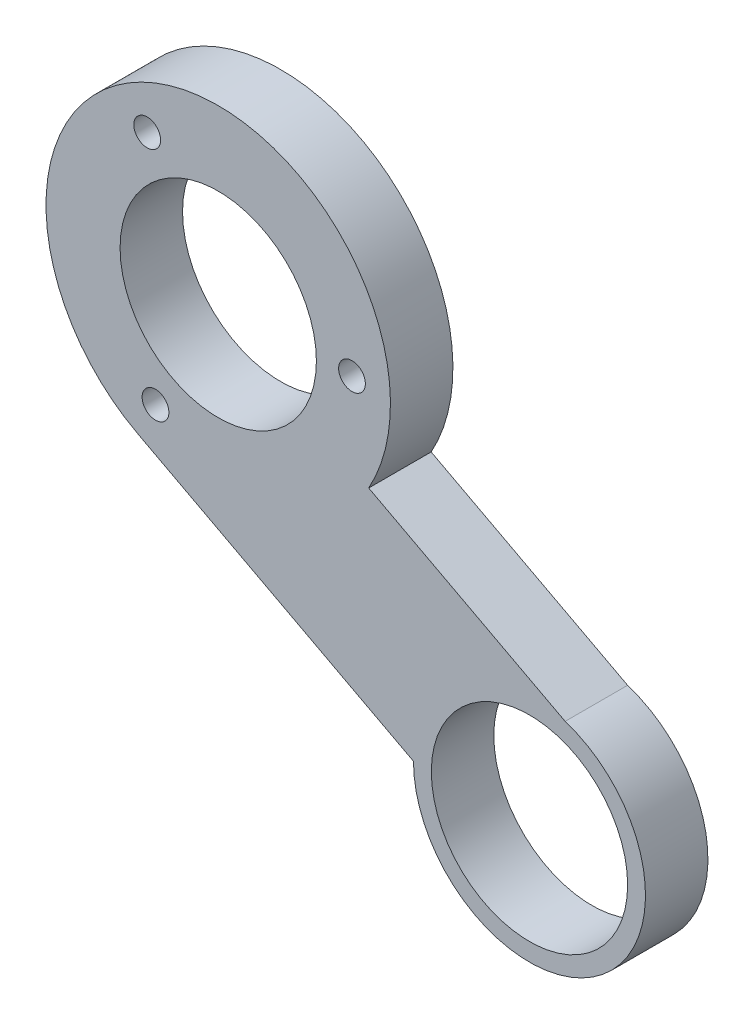
ISO-10303-21;
HEADER;
FILE_DESCRIPTION(('STEP AP214'),'2;1');
FILE_NAME('part.step','',(''),(''),'','','');
FILE_SCHEMA(('AUTOMOTIVE_DESIGN { 1 0 10303 214 1 1 1 1 }'));
ENDSEC;
DATA;
#1=APPLICATION_CONTEXT('core data for automotive mechanical design processes');
#2=APPLICATION_PROTOCOL_DEFINITION('international standard','automotive_design',2000,#1);
#3=PRODUCT_CONTEXT('',#1,'mechanical');
#4=PRODUCT('Part','Part','',(#3));
#5=PRODUCT_RELATED_PRODUCT_CATEGORY('part','',(#4));
#6=PRODUCT_DEFINITION_FORMATION('','',#4);
#7=PRODUCT_DEFINITION_CONTEXT('part definition',#1,'design');
#8=PRODUCT_DEFINITION('design','',#6,#7);
#9=PRODUCT_DEFINITION_SHAPE('','',#8);
#10=(LENGTH_UNIT() NAMED_UNIT(*) SI_UNIT(.MILLI.,.METRE.));
#11=(NAMED_UNIT(*) PLANE_ANGLE_UNIT() SI_UNIT($,.RADIAN.));
#12=(NAMED_UNIT(*) SI_UNIT($,.STERADIAN.) SOLID_ANGLE_UNIT());
#13=UNCERTAINTY_MEASURE_WITH_UNIT(LENGTH_MEASURE(1.E-05),#10,'distance_accuracy_value','');
#14=(GEOMETRIC_REPRESENTATION_CONTEXT(3) GLOBAL_UNCERTAINTY_ASSIGNED_CONTEXT((#13)) GLOBAL_UNIT_ASSIGNED_CONTEXT((#10,
#11,#12)) REPRESENTATION_CONTEXT('',''));
#15=CARTESIAN_POINT('',(0.,0.,0.));
#16=DIRECTION('',(0.,0.,1.));
#17=DIRECTION('',(1.,0.,0.));
#18=AXIS2_PLACEMENT_3D('',#15,#16,#17);
#19=CARTESIAN_POINT('',(-14.1274224536886,5.37928778044168,100.965717056062));
#20=DIRECTION('',(0.,0.,-1.));
#21=DIRECTION('',(-1.,0.,0.));
#22=AXIS2_PLACEMENT_3D('',#19,#20,#21);
#23=CYLINDRICAL_SURFACE('',#22,11.);
#24=CARTESIAN_POINT('',(-14.1274224536886,5.37928778044168,0.));
#25=DIRECTION('',(0.,0.,1.));
#26=DIRECTION('',(1.,0.,0.));
#27=AXIS2_PLACEMENT_3D('',#24,#25,#26);
#28=CIRCLE('',#27,11.);
#29=CARTESIAN_POINT('',(-25.1274224536886,5.37928778044168,0.));
#30=VERTEX_POINT('',#29);
#31=EDGE_CURVE('E129',#30,#30,#28,.T.);
#32=CARTESIAN_POINT('',(-14.1274224536886,5.37928778044168,7.00000000000442));
#33=DIRECTION('',(0.,0.,1.));
#34=DIRECTION('',(0.,-1.,0.));
#35=AXIS2_PLACEMENT_3D('',#32,#33,#34);
#36=CIRCLE('',#35,11.);
#37=CARTESIAN_POINT('',(-25.1274224536886,5.37928778044168,7.00000000000443));
#38=VERTEX_POINT('',#37);
#39=EDGE_CURVE('E108',#38,#38,#36,.T.);
#40=CARTESIAN_POINT('',(-25.1274224536886,5.37928778044168,0.));
#41=CARTESIAN_POINT('',(-25.1274224536886,5.37928778044168,0.0729166666667003));
#42=CARTESIAN_POINT('',(-25.1274224536886,5.37928778044168,0.145833333333414));
#43=CARTESIAN_POINT('',(-25.1274224536886,5.37928778044168,0.291666666666843));
#44=CARTESIAN_POINT('',(-25.1274224536886,5.37928778044168,0.364583333333557));
#45=CARTESIAN_POINT('',(-25.1274224536886,5.37928778044168,0.51041666666698));
#46=CARTESIAN_POINT('',(-25.1274224536886,5.37928778044168,0.58333333333369));
#47=CARTESIAN_POINT('',(-25.1274224536886,5.37928778044168,0.729166666667114));
#48=CARTESIAN_POINT('',(-25.1274224536886,5.37928778044168,0.802083333333828));
#49=CARTESIAN_POINT('',(-25.1274224536886,5.37928778044168,0.947916666667256));
#50=CARTESIAN_POINT('',(-25.1274224536886,5.37928778044168,1.02083333333397));
#51=CARTESIAN_POINT('',(-25.1274224536886,5.37928778044168,1.16666666666739));
#52=CARTESIAN_POINT('',(-25.1274224536886,5.37928778044168,1.2395833333341));
#53=CARTESIAN_POINT('',(-25.1274224536886,5.37928778044168,1.38541666666753));
#54=CARTESIAN_POINT('',(-25.1274224536886,5.37928778044168,1.45833333333424));
#55=CARTESIAN_POINT('',(-25.1274224536886,5.37928778044168,1.60416666666767));
#56=CARTESIAN_POINT('',(-25.1274224536886,5.37928778044168,1.67708333333438));
#57=CARTESIAN_POINT('',(-25.1274224536886,5.37928778044168,1.82291666666781));
#58=CARTESIAN_POINT('',(-25.1274224536886,5.37928778044168,1.89583333333453));
#59=CARTESIAN_POINT('',(-25.1274224536886,5.37928778044168,2.04166666666795));
#60=CARTESIAN_POINT('',(-25.1274224536886,5.37928778044168,2.11458333333467));
#61=CARTESIAN_POINT('',(-25.1274224536886,5.37928778044168,2.26041666666809));
#62=CARTESIAN_POINT('',(-25.1274224536886,5.37928778044168,2.3333333333348));
#63=CARTESIAN_POINT('',(-25.1274224536886,5.37928778044168,2.47916666666823));
#64=CARTESIAN_POINT('',(-25.1274224536886,5.37928778044168,2.55208333333494));
#65=CARTESIAN_POINT('',(-25.1274224536886,5.37928778044168,2.69791666666837));
#66=CARTESIAN_POINT('',(-25.1274224536886,5.37928778044168,2.77083333333508));
#67=CARTESIAN_POINT('',(-25.1274224536886,5.37928778044168,2.91666666666851));
#68=CARTESIAN_POINT('',(-25.1274224536886,5.37928778044168,2.98958333333522));
#69=CARTESIAN_POINT('',(-25.1274224536886,5.37928778044168,3.13541666666864));
#70=CARTESIAN_POINT('',(-25.1274224536886,5.37928778044168,3.20833333333535));
#71=CARTESIAN_POINT('',(-25.1274224536886,5.37928778044168,3.35416666666878));
#72=CARTESIAN_POINT('',(-25.1274224536886,5.37928778044168,3.4270833333355));
#73=CARTESIAN_POINT('',(-25.1274224536886,5.37928778044168,3.57291666666892));
#74=CARTESIAN_POINT('',(-25.1274224536886,5.37928778044168,3.64583333333564));
#75=CARTESIAN_POINT('',(-25.1274224536886,5.37928778044168,3.79166666666907));
#76=CARTESIAN_POINT('',(-25.1274224536886,5.37928778044168,3.86458333333578));
#77=CARTESIAN_POINT('',(-25.1274224536886,5.37928778044168,4.0104166666692));
#78=CARTESIAN_POINT('',(-25.1274224536886,5.37928778044168,4.08333333333591));
#79=CARTESIAN_POINT('',(-25.1274224536886,5.37928778044168,4.22916666666934));
#80=CARTESIAN_POINT('',(-25.1274224536886,5.37928778044168,4.30208333333605));
#81=CARTESIAN_POINT('',(-25.1274224536886,5.37928778044168,4.44791666666948));
#82=CARTESIAN_POINT('',(-25.1274224536886,5.37928778044168,4.52083333333619));
#83=CARTESIAN_POINT('',(-25.1274224536886,5.37928778044168,4.66666666666962));
#84=CARTESIAN_POINT('',(-25.1274224536886,5.37928778044168,4.73958333333633));
#85=CARTESIAN_POINT('',(-25.1274224536886,5.37928778044168,4.88541666666975));
#86=CARTESIAN_POINT('',(-25.1274224536886,5.37928778044168,4.95833333333646));
#87=CARTESIAN_POINT('',(-25.1274224536886,5.37928778044168,5.10416666666989));
#88=CARTESIAN_POINT('',(-25.1274224536886,5.37928778044168,5.17708333333661));
#89=CARTESIAN_POINT('',(-25.1274224536886,5.37928778044168,5.32291666667004));
#90=CARTESIAN_POINT('',(-25.1274224536886,5.37928778044168,5.39583333333675));
#91=CARTESIAN_POINT('',(-25.1274224536886,5.37928778044168,5.54166666667018));
#92=CARTESIAN_POINT('',(-25.1274224536886,5.37928778044168,5.61458333333689));
#93=CARTESIAN_POINT('',(-25.1274224536886,5.37928778044168,5.76041666667032));
#94=CARTESIAN_POINT('',(-25.1274224536886,5.37928778044168,5.83333333333703));
#95=CARTESIAN_POINT('',(-25.1274224536886,5.37928778044168,5.97916666667045));
#96=CARTESIAN_POINT('',(-25.1274224536886,5.37928778044168,6.05208333333716));
#97=CARTESIAN_POINT('',(-25.1274224536886,5.37928778044168,6.19791666667059));
#98=CARTESIAN_POINT('',(-25.1274224536886,5.37928778044168,6.27083333333731));
#99=CARTESIAN_POINT('',(-25.1274224536886,5.37928778044168,6.41666666667073));
#100=CARTESIAN_POINT('',(-25.1274224536886,5.37928778044168,6.48958333333744));
#101=CARTESIAN_POINT('',(-25.1274224536886,5.37928778044168,6.63541666667086));
#102=CARTESIAN_POINT('',(-25.1274224536886,5.37928778044168,6.70833333333758));
#103=CARTESIAN_POINT('',(-25.1274224536886,5.37928778044168,6.854166666671));
#104=CARTESIAN_POINT('',(-25.1274224536886,5.37928778044168,6.92708333333772));
#105=CARTESIAN_POINT('',(-25.1274224536886,5.37928778044168,7.00000000000443));
#106=B_SPLINE_CURVE_WITH_KNOTS('',3,(#40,#41,#42,#43,#44,#45,#46,#47,#48,#49,#50,#51,#52,#53,
#54,#55,#56,#57,#58,#59,#60,#61,#62,#63,#64,#65,#66,#67,#68,#69,#70,#71,#72,#73,#74,#75,#76,#77,
#78,#79,#80,#81,#82,#83,#84,#85,#86,#87,#88,#89,#90,#91,#92,#93,#94,#95,#96,#97,#98,#99,#100,
#101,#102,#103,#104,#105),.UNSPECIFIED.,.F.,.F.,(4,2,2,2,2,2,2,2,2,2,2,2,2,2,2,2,2,2,2,2,2,2,2,
2,2,2,2,2,2,2,2,2,4),(0.,0.218750000000142,0.437500000000285,0.656250000000413,
0.875000000000556,1.0937500000007,1.31250000000083,1.53125000000097,1.75000000000111,
1.96875000000125,2.1875000000014,2.40625000000153,2.62500000000167,2.84375000000181,
3.06250000000194,3.28125000000208,3.50000000000222,3.71875000000237,3.93750000000251,
4.15625000000264,4.37500000000278,4.59375000000292,4.81250000000305,5.03125000000319,
5.25000000000334,5.46875000000348,5.68750000000362,5.90625000000375,6.12500000000389,
6.34375000000403,6.56250000000416,6.78125000000431,7.00000000000445),.UNSPECIFIED.);
#107=EDGE_CURVE('BSEAM34',#30,#38,#106,.T.);
#108=ORIENTED_EDGE('',*,*,#31,.F.);
#109=ORIENTED_EDGE('',*,*,#39,.T.);
#110=ORIENTED_EDGE('',*,*,#107,.T.);
#111=ORIENTED_EDGE('',*,*,#107,.F.);
#112=EDGE_LOOP('',(#108,#110,#109,#111));
#113=FACE_BOUND('',#112,.T.);
#114=ADVANCED_FACE('F34',(#113),#23,.F.);
#115=CARTESIAN_POINT('',(-22.0878416801819,18.0927344310736,100.965717056062));
#116=DIRECTION('',(0.,0.,-1.));
#117=DIRECTION('',(-1.,0.,0.));
#118=AXIS2_PLACEMENT_3D('',#115,#116,#117);
#119=CYLINDRICAL_SURFACE('',#118,1.5);
#120=CARTESIAN_POINT('',(-22.0878416801819,18.0927344310736,0.));
#121=DIRECTION('',(0.,0.,1.));
#122=DIRECTION('',(1.,0.,0.));
#123=AXIS2_PLACEMENT_3D('',#120,#121,#122);
#124=CIRCLE('',#123,1.5);
#125=CARTESIAN_POINT('',(-23.5878416801819,18.0927344310736,0.));
#126=VERTEX_POINT('',#125);
#127=EDGE_CURVE('E126',#126,#126,#124,.T.);
#128=CARTESIAN_POINT('',(-22.0878416801819,18.0927344310736,7.00000000000442));
#129=DIRECTION('',(0.,0.,1.));
#130=DIRECTION('',(0.,-1.,0.));
#131=AXIS2_PLACEMENT_3D('',#128,#129,#130);
#132=CIRCLE('',#131,1.5);
#133=CARTESIAN_POINT('',(-23.5878416801819,18.0927344310736,7.00000000000443));
#134=VERTEX_POINT('',#133);
#135=EDGE_CURVE('E105',#134,#134,#132,.T.);
#136=CARTESIAN_POINT('',(-23.5878416801819,18.0927344310736,0.));
#137=CARTESIAN_POINT('',(-23.5878416801819,18.0927344310736,0.0729166666667003));
#138=CARTESIAN_POINT('',(-23.5878416801819,18.0927344310736,0.145833333333414));
#139=CARTESIAN_POINT('',(-23.5878416801819,18.0927344310736,0.291666666666843));
#140=CARTESIAN_POINT('',(-23.5878416801819,18.0927344310736,0.364583333333557));
#141=CARTESIAN_POINT('',(-23.5878416801819,18.0927344310736,0.51041666666698));
#142=CARTESIAN_POINT('',(-23.5878416801819,18.0927344310736,0.58333333333369));
#143=CARTESIAN_POINT('',(-23.5878416801819,18.0927344310736,0.729166666667114));
#144=CARTESIAN_POINT('',(-23.5878416801819,18.0927344310736,0.802083333333828));
#145=CARTESIAN_POINT('',(-23.5878416801819,18.0927344310736,0.947916666667256));
#146=CARTESIAN_POINT('',(-23.5878416801819,18.0927344310736,1.02083333333397));
#147=CARTESIAN_POINT('',(-23.5878416801819,18.0927344310736,1.16666666666739));
#148=CARTESIAN_POINT('',(-23.5878416801819,18.0927344310736,1.2395833333341));
#149=CARTESIAN_POINT('',(-23.5878416801819,18.0927344310736,1.38541666666753));
#150=CARTESIAN_POINT('',(-23.5878416801819,18.0927344310736,1.45833333333424));
#151=CARTESIAN_POINT('',(-23.5878416801819,18.0927344310736,1.60416666666767));
#152=CARTESIAN_POINT('',(-23.5878416801819,18.0927344310736,1.67708333333438));
#153=CARTESIAN_POINT('',(-23.5878416801819,18.0927344310736,1.82291666666781));
#154=CARTESIAN_POINT('',(-23.5878416801819,18.0927344310736,1.89583333333453));
#155=CARTESIAN_POINT('',(-23.5878416801819,18.0927344310736,2.04166666666795));
#156=CARTESIAN_POINT('',(-23.5878416801819,18.0927344310736,2.11458333333467));
#157=CARTESIAN_POINT('',(-23.5878416801819,18.0927344310736,2.26041666666809));
#158=CARTESIAN_POINT('',(-23.5878416801819,18.0927344310736,2.3333333333348));
#159=CARTESIAN_POINT('',(-23.5878416801819,18.0927344310736,2.47916666666823));
#160=CARTESIAN_POINT('',(-23.5878416801819,18.0927344310736,2.55208333333494));
#161=CARTESIAN_POINT('',(-23.5878416801819,18.0927344310736,2.69791666666837));
#162=CARTESIAN_POINT('',(-23.5878416801819,18.0927344310736,2.77083333333508));
#163=CARTESIAN_POINT('',(-23.5878416801819,18.0927344310736,2.91666666666851));
#164=CARTESIAN_POINT('',(-23.5878416801819,18.0927344310736,2.98958333333522));
#165=CARTESIAN_POINT('',(-23.5878416801819,18.0927344310736,3.13541666666864));
#166=CARTESIAN_POINT('',(-23.5878416801819,18.0927344310736,3.20833333333535));
#167=CARTESIAN_POINT('',(-23.5878416801819,18.0927344310736,3.35416666666878));
#168=CARTESIAN_POINT('',(-23.5878416801819,18.0927344310736,3.4270833333355));
#169=CARTESIAN_POINT('',(-23.5878416801819,18.0927344310736,3.57291666666892));
#170=CARTESIAN_POINT('',(-23.5878416801819,18.0927344310736,3.64583333333564));
#171=CARTESIAN_POINT('',(-23.5878416801819,18.0927344310736,3.79166666666907));
#172=CARTESIAN_POINT('',(-23.5878416801819,18.0927344310736,3.86458333333578));
#173=CARTESIAN_POINT('',(-23.5878416801819,18.0927344310736,4.0104166666692));
#174=CARTESIAN_POINT('',(-23.5878416801819,18.0927344310736,4.08333333333591));
#175=CARTESIAN_POINT('',(-23.5878416801819,18.0927344310736,4.22916666666934));
#176=CARTESIAN_POINT('',(-23.5878416801819,18.0927344310736,4.30208333333605));
#177=CARTESIAN_POINT('',(-23.5878416801819,18.0927344310736,4.44791666666948));
#178=CARTESIAN_POINT('',(-23.5878416801819,18.0927344310736,4.52083333333619));
#179=CARTESIAN_POINT('',(-23.5878416801819,18.0927344310736,4.66666666666962));
#180=CARTESIAN_POINT('',(-23.5878416801819,18.0927344310736,4.73958333333633));
#181=CARTESIAN_POINT('',(-23.5878416801819,18.0927344310736,4.88541666666975));
#182=CARTESIAN_POINT('',(-23.5878416801819,18.0927344310736,4.95833333333646));
#183=CARTESIAN_POINT('',(-23.5878416801819,18.0927344310736,5.10416666666989));
#184=CARTESIAN_POINT('',(-23.5878416801819,18.0927344310736,5.17708333333661));
#185=CARTESIAN_POINT('',(-23.5878416801819,18.0927344310736,5.32291666667004));
#186=CARTESIAN_POINT('',(-23.5878416801819,18.0927344310736,5.39583333333675));
#187=CARTESIAN_POINT('',(-23.5878416801819,18.0927344310736,5.54166666667018));
#188=CARTESIAN_POINT('',(-23.5878416801819,18.0927344310736,5.61458333333689));
#189=CARTESIAN_POINT('',(-23.5878416801819,18.0927344310736,5.76041666667032));
#190=CARTESIAN_POINT('',(-23.5878416801819,18.0927344310736,5.83333333333703));
#191=CARTESIAN_POINT('',(-23.5878416801819,18.0927344310736,5.97916666667045));
#192=CARTESIAN_POINT('',(-23.5878416801819,18.0927344310736,6.05208333333716));
#193=CARTESIAN_POINT('',(-23.5878416801819,18.0927344310736,6.19791666667059));
#194=CARTESIAN_POINT('',(-23.5878416801819,18.0927344310736,6.27083333333731));
#195=CARTESIAN_POINT('',(-23.5878416801819,18.0927344310736,6.41666666667073));
#196=CARTESIAN_POINT('',(-23.5878416801819,18.0927344310736,6.48958333333744));
#197=CARTESIAN_POINT('',(-23.5878416801819,18.0927344310736,6.63541666667086));
#198=CARTESIAN_POINT('',(-23.5878416801819,18.0927344310736,6.70833333333758));
#199=CARTESIAN_POINT('',(-23.5878416801819,18.0927344310736,6.854166666671));
#200=CARTESIAN_POINT('',(-23.5878416801819,18.0927344310736,6.92708333333772));
#201=CARTESIAN_POINT('',(-23.5878416801819,18.0927344310736,7.00000000000443));
#202=B_SPLINE_CURVE_WITH_KNOTS('',3,(#136,#137,#138,#139,#140,#141,#142,#143,#144,#145,#146,
#147,#148,#149,#150,#151,#152,#153,#154,#155,#156,#157,#158,#159,#160,#161,#162,#163,#164,#165,
#166,#167,#168,#169,#170,#171,#172,#173,#174,#175,#176,#177,#178,#179,#180,#181,#182,#183,#184,
#185,#186,#187,#188,#189,#190,#191,#192,#193,#194,#195,#196,#197,#198,#199,#200,#201),
.UNSPECIFIED.,.F.,.F.,(4,2,2,2,2,2,2,2,2,2,2,2,2,2,2,2,2,2,2,2,2,2,2,2,2,2,2,2,2,2,2,2,4),(0.,
0.218750000000142,0.437500000000285,0.656250000000413,0.875000000000556,1.0937500000007,
1.31250000000083,1.53125000000097,1.75000000000111,1.96875000000125,2.1875000000014,
2.40625000000153,2.62500000000167,2.84375000000181,3.06250000000194,3.28125000000208,
3.50000000000222,3.71875000000237,3.93750000000251,4.15625000000264,4.37500000000278,
4.59375000000292,4.81250000000305,5.03125000000319,5.25000000000334,5.46875000000348,
5.68750000000362,5.90625000000375,6.12500000000389,6.34375000000403,6.56250000000416,
6.78125000000431,7.00000000000445),.UNSPECIFIED.);
#203=EDGE_CURVE('BSEAM167',#126,#134,#202,.T.);
#204=ORIENTED_EDGE('',*,*,#127,.F.);
#205=ORIENTED_EDGE('',*,*,#135,.T.);
#206=ORIENTED_EDGE('',*,*,#203,.T.);
#207=ORIENTED_EDGE('',*,*,#203,.F.);
#208=EDGE_LOOP('',(#204,#206,#205,#207));
#209=FACE_BOUND('',#208,.T.);
#210=ADVANCED_FACE('F167',(#209),#119,.F.);
#211=CARTESIAN_POINT('',(0.862954928663872,5.91648973004253,100.965717056062));
#212=DIRECTION('',(0.,0.,-1.));
#213=DIRECTION('',(-1.,0.,0.));
#214=AXIS2_PLACEMENT_3D('',#211,#212,#213);
#215=CYLINDRICAL_SURFACE('',#214,1.5);
#216=CARTESIAN_POINT('',(0.862954928663872,5.91648973004253,0.));
#217=DIRECTION('',(0.,0.,1.));
#218=DIRECTION('',(1.,0.,0.));
#219=AXIS2_PLACEMENT_3D('',#216,#217,#218);
#220=CIRCLE('',#219,1.5);
#221=CARTESIAN_POINT('',(-0.637045071336128,5.91648973004253,0.));
#222=VERTEX_POINT('',#221);
#223=EDGE_CURVE('E123',#222,#222,#220,.T.);
#224=CARTESIAN_POINT('',(0.862954928663872,5.91648973004253,7.00000000000442));
#225=DIRECTION('',(0.,0.,1.));
#226=DIRECTION('',(0.,-1.,0.));
#227=AXIS2_PLACEMENT_3D('',#224,#225,#226);
#228=CIRCLE('',#227,1.5);
#229=CARTESIAN_POINT('',(-0.637045071336128,5.91648973004253,7.00000000000443));
#230=VERTEX_POINT('',#229);
#231=EDGE_CURVE('E102',#230,#230,#228,.T.);
#232=CARTESIAN_POINT('',(-0.637045071336128,5.91648973004253,0.));
#233=CARTESIAN_POINT('',(-0.637045071336128,5.91648973004253,0.0729166666667003));
#234=CARTESIAN_POINT('',(-0.637045071336128,5.91648973004253,0.145833333333414));
#235=CARTESIAN_POINT('',(-0.637045071336128,5.91648973004253,0.291666666666843));
#236=CARTESIAN_POINT('',(-0.637045071336128,5.91648973004253,0.364583333333557));
#237=CARTESIAN_POINT('',(-0.637045071336128,5.91648973004253,0.51041666666698));
#238=CARTESIAN_POINT('',(-0.637045071336128,5.91648973004253,0.58333333333369));
#239=CARTESIAN_POINT('',(-0.637045071336128,5.91648973004253,0.729166666667114));
#240=CARTESIAN_POINT('',(-0.637045071336128,5.91648973004253,0.802083333333828));
#241=CARTESIAN_POINT('',(-0.637045071336128,5.91648973004253,0.947916666667256));
#242=CARTESIAN_POINT('',(-0.637045071336128,5.91648973004253,1.02083333333397));
#243=CARTESIAN_POINT('',(-0.637045071336128,5.91648973004253,1.16666666666739));
#244=CARTESIAN_POINT('',(-0.637045071336128,5.91648973004253,1.2395833333341));
#245=CARTESIAN_POINT('',(-0.637045071336128,5.91648973004253,1.38541666666753));
#246=CARTESIAN_POINT('',(-0.637045071336128,5.91648973004253,1.45833333333424));
#247=CARTESIAN_POINT('',(-0.637045071336128,5.91648973004253,1.60416666666767));
#248=CARTESIAN_POINT('',(-0.637045071336128,5.91648973004253,1.67708333333438));
#249=CARTESIAN_POINT('',(-0.637045071336128,5.91648973004253,1.82291666666781));
#250=CARTESIAN_POINT('',(-0.637045071336128,5.91648973004253,1.89583333333453));
#251=CARTESIAN_POINT('',(-0.637045071336128,5.91648973004253,2.04166666666795));
#252=CARTESIAN_POINT('',(-0.637045071336128,5.91648973004253,2.11458333333467));
#253=CARTESIAN_POINT('',(-0.637045071336128,5.91648973004253,2.26041666666809));
#254=CARTESIAN_POINT('',(-0.637045071336128,5.91648973004253,2.3333333333348));
#255=CARTESIAN_POINT('',(-0.637045071336128,5.91648973004253,2.47916666666823));
#256=CARTESIAN_POINT('',(-0.637045071336128,5.91648973004253,2.55208333333494));
#257=CARTESIAN_POINT('',(-0.637045071336128,5.91648973004253,2.69791666666837));
#258=CARTESIAN_POINT('',(-0.637045071336128,5.91648973004253,2.77083333333508));
#259=CARTESIAN_POINT('',(-0.637045071336128,5.91648973004253,2.91666666666851));
#260=CARTESIAN_POINT('',(-0.637045071336128,5.91648973004253,2.98958333333522));
#261=CARTESIAN_POINT('',(-0.637045071336128,5.91648973004253,3.13541666666864));
#262=CARTESIAN_POINT('',(-0.637045071336128,5.91648973004253,3.20833333333535));
#263=CARTESIAN_POINT('',(-0.637045071336128,5.91648973004253,3.35416666666878));
#264=CARTESIAN_POINT('',(-0.637045071336128,5.91648973004253,3.4270833333355));
#265=CARTESIAN_POINT('',(-0.637045071336128,5.91648973004253,3.57291666666892));
#266=CARTESIAN_POINT('',(-0.637045071336128,5.91648973004253,3.64583333333564));
#267=CARTESIAN_POINT('',(-0.637045071336128,5.91648973004253,3.79166666666907));
#268=CARTESIAN_POINT('',(-0.637045071336128,5.91648973004253,3.86458333333578));
#269=CARTESIAN_POINT('',(-0.637045071336128,5.91648973004253,4.0104166666692));
#270=CARTESIAN_POINT('',(-0.637045071336128,5.91648973004253,4.08333333333591));
#271=CARTESIAN_POINT('',(-0.637045071336128,5.91648973004253,4.22916666666934));
#272=CARTESIAN_POINT('',(-0.637045071336128,5.91648973004253,4.30208333333605));
#273=CARTESIAN_POINT('',(-0.637045071336128,5.91648973004253,4.44791666666948));
#274=CARTESIAN_POINT('',(-0.637045071336128,5.91648973004253,4.52083333333619));
#275=CARTESIAN_POINT('',(-0.637045071336128,5.91648973004253,4.66666666666962));
#276=CARTESIAN_POINT('',(-0.637045071336128,5.91648973004253,4.73958333333633));
#277=CARTESIAN_POINT('',(-0.637045071336128,5.91648973004253,4.88541666666975));
#278=CARTESIAN_POINT('',(-0.637045071336128,5.91648973004253,4.95833333333646));
#279=CARTESIAN_POINT('',(-0.637045071336128,5.91648973004253,5.10416666666989));
#280=CARTESIAN_POINT('',(-0.637045071336128,5.91648973004253,5.17708333333661));
#281=CARTESIAN_POINT('',(-0.637045071336128,5.91648973004253,5.32291666667004));
#282=CARTESIAN_POINT('',(-0.637045071336128,5.91648973004253,5.39583333333675));
#283=CARTESIAN_POINT('',(-0.637045071336128,5.91648973004253,5.54166666667018));
#284=CARTESIAN_POINT('',(-0.637045071336128,5.91648973004253,5.61458333333689));
#285=CARTESIAN_POINT('',(-0.637045071336128,5.91648973004253,5.76041666667032));
#286=CARTESIAN_POINT('',(-0.637045071336128,5.91648973004253,5.83333333333703));
#287=CARTESIAN_POINT('',(-0.637045071336128,5.91648973004253,5.97916666667045));
#288=CARTESIAN_POINT('',(-0.637045071336128,5.91648973004253,6.05208333333716));
#289=CARTESIAN_POINT('',(-0.637045071336128,5.91648973004253,6.19791666667059));
#290=CARTESIAN_POINT('',(-0.637045071336128,5.91648973004253,6.27083333333731));
#291=CARTESIAN_POINT('',(-0.637045071336128,5.91648973004253,6.41666666667073));
#292=CARTESIAN_POINT('',(-0.637045071336128,5.91648973004253,6.48958333333744));
#293=CARTESIAN_POINT('',(-0.637045071336128,5.91648973004253,6.63541666667086));
#294=CARTESIAN_POINT('',(-0.637045071336128,5.91648973004253,6.70833333333758));
#295=CARTESIAN_POINT('',(-0.637045071336128,5.91648973004253,6.854166666671));
#296=CARTESIAN_POINT('',(-0.637045071336128,5.91648973004253,6.92708333333772));
#297=CARTESIAN_POINT('',(-0.637045071336128,5.91648973004253,7.00000000000443));
#298=B_SPLINE_CURVE_WITH_KNOTS('',3,(#232,#233,#234,#235,#236,#237,#238,#239,#240,#241,#242,
#243,#244,#245,#246,#247,#248,#249,#250,#251,#252,#253,#254,#255,#256,#257,#258,#259,#260,#261,
#262,#263,#264,#265,#266,#267,#268,#269,#270,#271,#272,#273,#274,#275,#276,#277,#278,#279,#280,
#281,#282,#283,#284,#285,#286,#287,#288,#289,#290,#291,#292,#293,#294,#295,#296,#297),
.UNSPECIFIED.,.F.,.F.,(4,2,2,2,2,2,2,2,2,2,2,2,2,2,2,2,2,2,2,2,2,2,2,2,2,2,2,2,2,2,2,2,4),(0.,
0.218750000000142,0.437500000000285,0.656250000000413,0.875000000000556,1.0937500000007,
1.31250000000083,1.53125000000097,1.75000000000111,1.96875000000125,2.1875000000014,
2.40625000000153,2.62500000000167,2.84375000000181,3.06250000000194,3.28125000000208,
3.50000000000222,3.71875000000237,3.93750000000251,4.15625000000264,4.37500000000278,
4.59375000000292,4.81250000000305,5.03125000000319,5.25000000000334,5.46875000000348,
5.68750000000362,5.90625000000375,6.12500000000389,6.34375000000403,6.56250000000416,
6.78125000000431,7.00000000000445),.UNSPECIFIED.);
#299=EDGE_CURVE('BSEAM173',#222,#230,#298,.T.);
#300=ORIENTED_EDGE('',*,*,#223,.F.);
#301=ORIENTED_EDGE('',*,*,#231,.T.);
#302=ORIENTED_EDGE('',*,*,#299,.T.);
#303=ORIENTED_EDGE('',*,*,#299,.F.);
#304=EDGE_LOOP('',(#300,#302,#301,#303));
#305=FACE_BOUND('',#304,.T.);
#306=ADVANCED_FACE('F173',(#305),#215,.F.);
#307=CARTESIAN_POINT('',(-21.1573806095477,-7.87136081979225,100.965717056062));
#308=DIRECTION('',(0.,0.,-1.));
#309=DIRECTION('',(-1.,0.,0.));
#310=AXIS2_PLACEMENT_3D('',#307,#308,#309);
#311=CYLINDRICAL_SURFACE('',#310,1.5);
#312=CARTESIAN_POINT('',(-21.1573806095477,-7.87136081979225,0.));
#313=DIRECTION('',(0.,0.,1.));
#314=DIRECTION('',(1.,0.,0.));
#315=AXIS2_PLACEMENT_3D('',#312,#313,#314);
#316=CIRCLE('',#315,1.5);
#317=CARTESIAN_POINT('',(-22.6573806095477,-7.87136081979225,0.));
#318=VERTEX_POINT('',#317);
#319=EDGE_CURVE('E120',#318,#318,#316,.T.);
#320=CARTESIAN_POINT('',(-21.1573806095477,-7.87136081979225,7.00000000000442));
#321=DIRECTION('',(0.,0.,1.));
#322=DIRECTION('',(0.,-1.,0.));
#323=AXIS2_PLACEMENT_3D('',#320,#321,#322);
#324=CIRCLE('',#323,1.5);
#325=CARTESIAN_POINT('',(-22.6573806095477,-7.87136081979225,7.00000000000443));
#326=VERTEX_POINT('',#325);
#327=EDGE_CURVE('E91',#326,#326,#324,.T.);
#328=CARTESIAN_POINT('',(-22.6573806095477,-7.87136081979225,0.));
#329=CARTESIAN_POINT('',(-22.6573806095477,-7.87136081979225,0.0729166666667003));
#330=CARTESIAN_POINT('',(-22.6573806095477,-7.87136081979225,0.145833333333414));
#331=CARTESIAN_POINT('',(-22.6573806095477,-7.87136081979225,0.291666666666843));
#332=CARTESIAN_POINT('',(-22.6573806095477,-7.87136081979225,0.364583333333557));
#333=CARTESIAN_POINT('',(-22.6573806095477,-7.87136081979225,0.51041666666698));
#334=CARTESIAN_POINT('',(-22.6573806095477,-7.87136081979225,0.58333333333369));
#335=CARTESIAN_POINT('',(-22.6573806095477,-7.87136081979225,0.729166666667114));
#336=CARTESIAN_POINT('',(-22.6573806095477,-7.87136081979225,0.802083333333828));
#337=CARTESIAN_POINT('',(-22.6573806095477,-7.87136081979225,0.947916666667256));
#338=CARTESIAN_POINT('',(-22.6573806095477,-7.87136081979225,1.02083333333397));
#339=CARTESIAN_POINT('',(-22.6573806095477,-7.87136081979225,1.16666666666739));
#340=CARTESIAN_POINT('',(-22.6573806095477,-7.87136081979225,1.2395833333341));
#341=CARTESIAN_POINT('',(-22.6573806095477,-7.87136081979225,1.38541666666753));
#342=CARTESIAN_POINT('',(-22.6573806095477,-7.87136081979225,1.45833333333424));
#343=CARTESIAN_POINT('',(-22.6573806095477,-7.87136081979225,1.60416666666767));
#344=CARTESIAN_POINT('',(-22.6573806095477,-7.87136081979225,1.67708333333438));
#345=CARTESIAN_POINT('',(-22.6573806095477,-7.87136081979225,1.82291666666781));
#346=CARTESIAN_POINT('',(-22.6573806095477,-7.87136081979225,1.89583333333453));
#347=CARTESIAN_POINT('',(-22.6573806095477,-7.87136081979225,2.04166666666795));
#348=CARTESIAN_POINT('',(-22.6573806095477,-7.87136081979225,2.11458333333467));
#349=CARTESIAN_POINT('',(-22.6573806095477,-7.87136081979225,2.26041666666809));
#350=CARTESIAN_POINT('',(-22.6573806095477,-7.87136081979225,2.3333333333348));
#351=CARTESIAN_POINT('',(-22.6573806095477,-7.87136081979225,2.47916666666823));
#352=CARTESIAN_POINT('',(-22.6573806095477,-7.87136081979225,2.55208333333494));
#353=CARTESIAN_POINT('',(-22.6573806095477,-7.87136081979225,2.69791666666837));
#354=CARTESIAN_POINT('',(-22.6573806095477,-7.87136081979225,2.77083333333508));
#355=CARTESIAN_POINT('',(-22.6573806095477,-7.87136081979225,2.91666666666851));
#356=CARTESIAN_POINT('',(-22.6573806095477,-7.87136081979225,2.98958333333522));
#357=CARTESIAN_POINT('',(-22.6573806095477,-7.87136081979225,3.13541666666864));
#358=CARTESIAN_POINT('',(-22.6573806095477,-7.87136081979225,3.20833333333535));
#359=CARTESIAN_POINT('',(-22.6573806095477,-7.87136081979225,3.35416666666878));
#360=CARTESIAN_POINT('',(-22.6573806095477,-7.87136081979225,3.4270833333355));
#361=CARTESIAN_POINT('',(-22.6573806095477,-7.87136081979225,3.57291666666892));
#362=CARTESIAN_POINT('',(-22.6573806095477,-7.87136081979225,3.64583333333564));
#363=CARTESIAN_POINT('',(-22.6573806095477,-7.87136081979225,3.79166666666907));
#364=CARTESIAN_POINT('',(-22.6573806095477,-7.87136081979225,3.86458333333578));
#365=CARTESIAN_POINT('',(-22.6573806095477,-7.87136081979225,4.0104166666692));
#366=CARTESIAN_POINT('',(-22.6573806095477,-7.87136081979225,4.08333333333591));
#367=CARTESIAN_POINT('',(-22.6573806095477,-7.87136081979225,4.22916666666934));
#368=CARTESIAN_POINT('',(-22.6573806095477,-7.87136081979225,4.30208333333605));
#369=CARTESIAN_POINT('',(-22.6573806095477,-7.87136081979225,4.44791666666948));
#370=CARTESIAN_POINT('',(-22.6573806095477,-7.87136081979225,4.52083333333619));
#371=CARTESIAN_POINT('',(-22.6573806095477,-7.87136081979225,4.66666666666962));
#372=CARTESIAN_POINT('',(-22.6573806095477,-7.87136081979225,4.73958333333633));
#373=CARTESIAN_POINT('',(-22.6573806095477,-7.87136081979225,4.88541666666975));
#374=CARTESIAN_POINT('',(-22.6573806095477,-7.87136081979225,4.95833333333646));
#375=CARTESIAN_POINT('',(-22.6573806095477,-7.87136081979225,5.10416666666989));
#376=CARTESIAN_POINT('',(-22.6573806095477,-7.87136081979225,5.17708333333661));
#377=CARTESIAN_POINT('',(-22.6573806095477,-7.87136081979225,5.32291666667004));
#378=CARTESIAN_POINT('',(-22.6573806095477,-7.87136081979225,5.39583333333675));
#379=CARTESIAN_POINT('',(-22.6573806095477,-7.87136081979225,5.54166666667018));
#380=CARTESIAN_POINT('',(-22.6573806095477,-7.87136081979225,5.61458333333689));
#381=CARTESIAN_POINT('',(-22.6573806095477,-7.87136081979225,5.76041666667032));
#382=CARTESIAN_POINT('',(-22.6573806095477,-7.87136081979225,5.83333333333703));
#383=CARTESIAN_POINT('',(-22.6573806095477,-7.87136081979225,5.97916666667045));
#384=CARTESIAN_POINT('',(-22.6573806095477,-7.87136081979225,6.05208333333716));
#385=CARTESIAN_POINT('',(-22.6573806095477,-7.87136081979225,6.19791666667059));
#386=CARTESIAN_POINT('',(-22.6573806095477,-7.87136081979225,6.27083333333731));
#387=CARTESIAN_POINT('',(-22.6573806095477,-7.87136081979225,6.41666666667073));
#388=CARTESIAN_POINT('',(-22.6573806095477,-7.87136081979225,6.48958333333744));
#389=CARTESIAN_POINT('',(-22.6573806095477,-7.87136081979225,6.63541666667086));
#390=CARTESIAN_POINT('',(-22.6573806095477,-7.87136081979225,6.70833333333758));
#391=CARTESIAN_POINT('',(-22.6573806095477,-7.87136081979225,6.854166666671));
#392=CARTESIAN_POINT('',(-22.6573806095477,-7.87136081979225,6.92708333333772));
#393=CARTESIAN_POINT('',(-22.6573806095477,-7.87136081979225,7.00000000000443));
#394=B_SPLINE_CURVE_WITH_KNOTS('',3,(#328,#329,#330,#331,#332,#333,#334,#335,#336,#337,#338,
#339,#340,#341,#342,#343,#344,#345,#346,#347,#348,#349,#350,#351,#352,#353,#354,#355,#356,#357,
#358,#359,#360,#361,#362,#363,#364,#365,#366,#367,#368,#369,#370,#371,#372,#373,#374,#375,#376,
#377,#378,#379,#380,#381,#382,#383,#384,#385,#386,#387,#388,#389,#390,#391,#392,#393),
.UNSPECIFIED.,.F.,.F.,(4,2,2,2,2,2,2,2,2,2,2,2,2,2,2,2,2,2,2,2,2,2,2,2,2,2,2,2,2,2,2,2,4),(0.,
0.218750000000142,0.437500000000285,0.656250000000413,0.875000000000556,1.0937500000007,
1.31250000000083,1.53125000000097,1.75000000000111,1.96875000000125,2.1875000000014,
2.40625000000153,2.62500000000167,2.84375000000181,3.06250000000194,3.28125000000208,
3.50000000000222,3.71875000000237,3.93750000000251,4.15625000000264,4.37500000000278,
4.59375000000292,4.81250000000305,5.03125000000319,5.25000000000334,5.46875000000348,
5.68750000000362,5.90625000000375,6.12500000000389,6.34375000000403,6.56250000000416,
6.78125000000431,7.00000000000445),.UNSPECIFIED.);
#395=EDGE_CURVE('BSEAM180',#318,#326,#394,.T.);
#396=ORIENTED_EDGE('',*,*,#319,.F.);
#397=ORIENTED_EDGE('',*,*,#327,.T.);
#398=ORIENTED_EDGE('',*,*,#395,.T.);
#399=ORIENTED_EDGE('',*,*,#395,.F.);
#400=EDGE_LOOP('',(#396,#398,#397,#399));
#401=FACE_BOUND('',#400,.T.);
#402=ADVANCED_FACE('F180',(#401),#311,.F.);
#403=CARTESIAN_POINT('',(-14.1274224536886,5.37928778044168,100.965717056062));
#404=DIRECTION('',(0.,0.,-1.));
#405=DIRECTION('',(-1.,0.,0.));
#406=AXIS2_PLACEMENT_3D('',#403,#404,#405);
#407=CYLINDRICAL_SURFACE('',#406,19.3);
#408=CARTESIAN_POINT('',(-14.1274224536886,5.37928778044168,7.00000000000442));
#409=DIRECTION('',(0.,0.,1.));
#410=DIRECTION('',(0.,-1.,0.));
#411=AXIS2_PLACEMENT_3D('',#408,#409,#410);
#412=CIRCLE('',#411,19.3);
#413=CARTESIAN_POINT('',(2.7344865587325,-4.01038870263438,7.00000000000445));
#414=VERTEX_POINT('',#413);
#415=CARTESIAN_POINT('',(-23.1480731609625,-11.6828885408064,7.00000000000442));
#416=VERTEX_POINT('',#415);
#417=EDGE_CURVE('E79',#414,#416,#412,.T.);
#418=ORIENTED_EDGE('',*,*,#417,.F.);
#419=DIRECTION('',(0.,0.,-1.));
#420=VECTOR('',#419,1.);
#421=CARTESIAN_POINT('',(2.7344865587325,-4.01038870263438,100.965717056062));
#422=LINE('',#421,#420);
#423=CARTESIAN_POINT('',(2.7344865587325,-4.01038870263438,0.));
#424=VERTEX_POINT('',#423);
#425=EDGE_CURVE('E50',#414,#424,#422,.T.);
#426=ORIENTED_EDGE('',*,*,#425,.T.);
#427=CARTESIAN_POINT('',(-14.1274224536886,5.37928778044168,0.));
#428=DIRECTION('',(0.,0.,1.));
#429=DIRECTION('',(1.,0.,0.));
#430=AXIS2_PLACEMENT_3D('',#427,#428,#429);
#431=CIRCLE('',#430,19.3);
#432=CARTESIAN_POINT('',(-23.1480731609625,-11.6828885408064,0.));
#433=VERTEX_POINT('',#432);
#434=EDGE_CURVE('E82',#424,#433,#431,.T.);
#435=ORIENTED_EDGE('',*,*,#434,.T.);
#436=DIRECTION('',(0.,0.,-1.));
#437=VECTOR('',#436,1.);
#438=CARTESIAN_POINT('',(-23.1480731609625,-11.6828885408064,100.965717056062));
#439=LINE('',#438,#437);
#440=EDGE_CURVE('E75',#416,#433,#439,.T.);
#441=ORIENTED_EDGE('',*,*,#440,.F.);
#442=EDGE_LOOP('',(#418,#426,#435,#441));
#443=FACE_BOUND('',#442,.T.);
#444=ADVANCED_FACE('F77',(#443),#407,.T.);
#445=CARTESIAN_POINT('',(-1.05972148528049,-2.00441802038635,100.965717056062));
#446=DIRECTION('',(0.46739122835616,0.884050586593165,0.));
#447=DIRECTION('',(-0.884050586593165,0.46739122835616,0.));
#448=AXIS2_PLACEMENT_3D('',#445,#446,#447);
#449=PLANE('',#448);
#450=ORIENTED_EDGE('',*,*,#425,.F.);
#451=DIRECTION('',(0.884050586593165,-0.46739122835616,0.));
#452=VECTOR('',#451,1.);
#453=CARTESIAN_POINT('',(-1.0597214852805,-2.00441802038635,7.00000000000442));
#454=LINE('',#453,#452);
#455=CARTESIAN_POINT('',(24.7494479390467,-15.6495414816752,7.00000000000445));
#456=VERTEX_POINT('',#455);
#457=EDGE_CURVE('E94',#414,#456,#454,.T.);
#458=ORIENTED_EDGE('',*,*,#457,.T.);
#459=DIRECTION('',(0.,0.,-1.));
#460=VECTOR('',#459,1.);
#461=CARTESIAN_POINT('',(24.7494479390467,-15.6495414816752,100.965717056062));
#462=LINE('',#461,#460);
#463=CARTESIAN_POINT('',(24.7494479390467,-15.6495414816752,0.));
#464=VERTEX_POINT('',#463);
#465=EDGE_CURVE('E43',#456,#464,#462,.T.);
#466=ORIENTED_EDGE('',*,*,#465,.T.);
#467=DIRECTION('',(0.884050586593165,-0.46739122835616,0.));
#468=VECTOR('',#467,1.);
#469=CARTESIAN_POINT('',(-1.05972148528049,-2.00441802038635,0.));
#470=LINE('',#469,#468);
#471=EDGE_CURVE('E116',#424,#464,#470,.T.);
#472=ORIENTED_EDGE('',*,*,#471,.F.);
#473=EDGE_LOOP('',(#450,#458,#466,#472));
#474=FACE_BOUND('',#473,.T.);
#475=ADVANCED_FACE('F135',(#474),#449,.T.);
#476=CARTESIAN_POINT('',(20.7527147066932,-28.0199142921203,100.965717056062));
#477=DIRECTION('',(0.,0.,-1.));
#478=DIRECTION('',(-1.,0.,0.));
#479=AXIS2_PLACEMENT_3D('',#476,#477,#478);
#480=CYLINDRICAL_SURFACE('',#479,13.);
#481=CARTESIAN_POINT('',(20.7527147066932,-28.0199142921203,7.00000000000442));
#482=DIRECTION('',(0.,0.,1.));
#483=DIRECTION('',(0.,-1.,0.));
#484=AXIS2_PLACEMENT_3D('',#481,#482,#483);
#485=CIRCLE('',#484,13.);
#486=CARTESIAN_POINT('',(7.75271470669319,-28.0199142921203,7.00000000000445));
#487=VERTEX_POINT('',#486);
#488=EDGE_CURVE('E57',#487,#456,#485,.T.);
#489=ORIENTED_EDGE('',*,*,#488,.F.);
#490=DIRECTION('',(0.,0.,-1.));
#491=VECTOR('',#490,1.);
#492=CARTESIAN_POINT('',(7.75271470669319,-28.0199142921203,100.965717056062));
#493=LINE('',#492,#491);
#494=CARTESIAN_POINT('',(7.75271470669319,-28.0199142921203,0.));
#495=VERTEX_POINT('',#494);
#496=EDGE_CURVE('E11',#487,#495,#493,.T.);
#497=ORIENTED_EDGE('',*,*,#496,.T.);
#498=CARTESIAN_POINT('',(20.7527147066932,-28.0199142921203,0.));
#499=DIRECTION('',(0.,0.,1.));
#500=DIRECTION('',(1.,0.,0.));
#501=AXIS2_PLACEMENT_3D('',#498,#499,#500);
#502=CIRCLE('',#501,13.);
#503=EDGE_CURVE('E113',#495,#464,#502,.T.);
#504=ORIENTED_EDGE('',*,*,#503,.T.);
#505=ORIENTED_EDGE('',*,*,#465,.F.);
#506=EDGE_LOOP('',(#489,#497,#504,#505));
#507=FACE_BOUND('',#506,.T.);
#508=ADVANCED_FACE('F137',(#507),#480,.T.);
#509=CARTESIAN_POINT('',(-9.88414236149531,-18.6954339801852,100.965717056062));
#510=DIRECTION('',(0.46739122835616,0.884050586593165,0.));
#511=DIRECTION('',(-0.884050586593165,0.46739122835616,0.));
#512=AXIS2_PLACEMENT_3D('',#509,#510,#511);
#513=PLANE('',#512);
#514=DIRECTION('',(0.884050586593165,-0.46739122835616,0.));
#515=VECTOR('',#514,1.);
#516=CARTESIAN_POINT('',(-9.88414236149531,-18.6954339801852,7.00000000000442));
#517=LINE('',#516,#515);
#518=EDGE_CURVE('E89',#416,#487,#517,.T.);
#519=ORIENTED_EDGE('',*,*,#518,.F.);
#520=ORIENTED_EDGE('',*,*,#440,.T.);
#521=DIRECTION('',(0.884050586593165,-0.46739122835616,0.));
#522=VECTOR('',#521,1.);
#523=CARTESIAN_POINT('',(-9.88414236149531,-18.6954339801852,0.));
#524=LINE('',#523,#522);
#525=EDGE_CURVE('E111',#433,#495,#524,.T.);
#526=ORIENTED_EDGE('',*,*,#525,.T.);
#527=ORIENTED_EDGE('',*,*,#496,.F.);
#528=EDGE_LOOP('',(#519,#520,#526,#527));
#529=FACE_BOUND('',#528,.T.);
#530=ADVANCED_FACE('F36',(#529),#513,.F.);
#531=CARTESIAN_POINT('',(0.,0.,0.));
#532=DIRECTION('',(0.,0.,1.));
#533=DIRECTION('',(1.,0.,0.));
#534=AXIS2_PLACEMENT_3D('',#531,#532,#533);
#535=PLANE('',#534);
#536=ORIENTED_EDGE('',*,*,#525,.F.);
#537=ORIENTED_EDGE('',*,*,#434,.F.);
#538=ORIENTED_EDGE('',*,*,#471,.T.);
#539=ORIENTED_EDGE('',*,*,#503,.F.);
#540=EDGE_LOOP('',(#536,#537,#538,#539));
#541=FACE_BOUND('',#540,.T.);
#542=ORIENTED_EDGE('',*,*,#319,.T.);
#543=EDGE_LOOP('',(#542));
#544=FACE_BOUND('',#543,.T.);
#545=ORIENTED_EDGE('',*,*,#223,.T.);
#546=EDGE_LOOP('',(#545));
#547=FACE_BOUND('',#546,.T.);
#548=ORIENTED_EDGE('',*,*,#127,.T.);
#549=EDGE_LOOP('',(#548));
#550=FACE_BOUND('',#549,.T.);
#551=ORIENTED_EDGE('',*,*,#31,.T.);
#552=EDGE_LOOP('',(#551));
#553=FACE_BOUND('',#552,.T.);
#554=CARTESIAN_POINT('',(20.7527147066932,-28.0199142921203,0.));
#555=DIRECTION('',(0.,0.,1.));
#556=DIRECTION('',(1.,0.,0.));
#557=AXIS2_PLACEMENT_3D('',#554,#555,#556);
#558=CIRCLE('',#557,11.);
#559=CARTESIAN_POINT('',(9.75271470669319,-28.0199142921203,0.));
#560=VERTEX_POINT('',#559);
#561=EDGE_CURVE('E86',#560,#560,#558,.T.);
#562=ORIENTED_EDGE('',*,*,#561,.T.);
#563=EDGE_LOOP('',(#562));
#564=FACE_BOUND('',#563,.T.);
#565=ADVANCED_FACE('F139',(#541,#544,#547,#550,#553,#564),#535,.F.);
#566=CARTESIAN_POINT('',(20.7527147066932,-28.0199142921203,100.965717056062));
#567=DIRECTION('',(0.,0.,-1.));
#568=DIRECTION('',(-1.,0.,0.));
#569=AXIS2_PLACEMENT_3D('',#566,#567,#568);
#570=CYLINDRICAL_SURFACE('',#569,11.);
#571=CARTESIAN_POINT('',(20.7527147066932,-28.0199142921203,7.00000000000442));
#572=DIRECTION('',(0.,0.,1.));
#573=DIRECTION('',(0.,-1.,0.));
#574=AXIS2_PLACEMENT_3D('',#571,#572,#573);
#575=CIRCLE('',#574,11.);
#576=CARTESIAN_POINT('',(9.75271470669319,-28.0199142921203,7.00000000000443));
#577=VERTEX_POINT('',#576);
#578=EDGE_CURVE('E38',#577,#577,#575,.T.);
#579=CARTESIAN_POINT('',(9.75271470669319,-28.0199142921203,0.));
#580=CARTESIAN_POINT('',(9.75271470669319,-28.0199142921203,0.0729166666667003));
#581=CARTESIAN_POINT('',(9.75271470669319,-28.0199142921203,0.145833333333414));
#582=CARTESIAN_POINT('',(9.75271470669319,-28.0199142921203,0.291666666666843));
#583=CARTESIAN_POINT('',(9.75271470669319,-28.0199142921203,0.364583333333557));
#584=CARTESIAN_POINT('',(9.75271470669319,-28.0199142921203,0.51041666666698));
#585=CARTESIAN_POINT('',(9.75271470669319,-28.0199142921203,0.58333333333369));
#586=CARTESIAN_POINT('',(9.75271470669319,-28.0199142921203,0.729166666667114));
#587=CARTESIAN_POINT('',(9.75271470669319,-28.0199142921203,0.802083333333828));
#588=CARTESIAN_POINT('',(9.75271470669319,-28.0199142921203,0.947916666667256));
#589=CARTESIAN_POINT('',(9.75271470669319,-28.0199142921203,1.02083333333397));
#590=CARTESIAN_POINT('',(9.75271470669319,-28.0199142921203,1.16666666666739));
#591=CARTESIAN_POINT('',(9.75271470669319,-28.0199142921203,1.2395833333341));
#592=CARTESIAN_POINT('',(9.75271470669319,-28.0199142921203,1.38541666666753));
#593=CARTESIAN_POINT('',(9.75271470669319,-28.0199142921203,1.45833333333424));
#594=CARTESIAN_POINT('',(9.75271470669319,-28.0199142921203,1.60416666666767));
#595=CARTESIAN_POINT('',(9.75271470669319,-28.0199142921203,1.67708333333438));
#596=CARTESIAN_POINT('',(9.75271470669319,-28.0199142921203,1.82291666666781));
#597=CARTESIAN_POINT('',(9.75271470669319,-28.0199142921203,1.89583333333453));
#598=CARTESIAN_POINT('',(9.75271470669319,-28.0199142921203,2.04166666666795));
#599=CARTESIAN_POINT('',(9.75271470669319,-28.0199142921203,2.11458333333467));
#600=CARTESIAN_POINT('',(9.75271470669319,-28.0199142921203,2.26041666666809));
#601=CARTESIAN_POINT('',(9.75271470669319,-28.0199142921203,2.3333333333348));
#602=CARTESIAN_POINT('',(9.75271470669319,-28.0199142921203,2.47916666666823));
#603=CARTESIAN_POINT('',(9.75271470669319,-28.0199142921203,2.55208333333494));
#604=CARTESIAN_POINT('',(9.75271470669319,-28.0199142921203,2.69791666666837));
#605=CARTESIAN_POINT('',(9.75271470669319,-28.0199142921203,2.77083333333508));
#606=CARTESIAN_POINT('',(9.75271470669319,-28.0199142921203,2.91666666666851));
#607=CARTESIAN_POINT('',(9.75271470669319,-28.0199142921203,2.98958333333522));
#608=CARTESIAN_POINT('',(9.75271470669319,-28.0199142921203,3.13541666666864));
#609=CARTESIAN_POINT('',(9.75271470669319,-28.0199142921203,3.20833333333535));
#610=CARTESIAN_POINT('',(9.75271470669319,-28.0199142921203,3.35416666666878));
#611=CARTESIAN_POINT('',(9.75271470669319,-28.0199142921203,3.4270833333355));
#612=CARTESIAN_POINT('',(9.75271470669319,-28.0199142921203,3.57291666666892));
#613=CARTESIAN_POINT('',(9.75271470669319,-28.0199142921203,3.64583333333564));
#614=CARTESIAN_POINT('',(9.75271470669319,-28.0199142921203,3.79166666666907));
#615=CARTESIAN_POINT('',(9.75271470669319,-28.0199142921203,3.86458333333578));
#616=CARTESIAN_POINT('',(9.75271470669319,-28.0199142921203,4.0104166666692));
#617=CARTESIAN_POINT('',(9.75271470669319,-28.0199142921203,4.08333333333591));
#618=CARTESIAN_POINT('',(9.75271470669319,-28.0199142921203,4.22916666666934));
#619=CARTESIAN_POINT('',(9.75271470669319,-28.0199142921203,4.30208333333605));
#620=CARTESIAN_POINT('',(9.75271470669319,-28.0199142921203,4.44791666666948));
#621=CARTESIAN_POINT('',(9.75271470669319,-28.0199142921203,4.52083333333619));
#622=CARTESIAN_POINT('',(9.75271470669319,-28.0199142921203,4.66666666666962));
#623=CARTESIAN_POINT('',(9.75271470669319,-28.0199142921203,4.73958333333633));
#624=CARTESIAN_POINT('',(9.75271470669319,-28.0199142921203,4.88541666666975));
#625=CARTESIAN_POINT('',(9.75271470669319,-28.0199142921203,4.95833333333646));
#626=CARTESIAN_POINT('',(9.75271470669319,-28.0199142921203,5.10416666666989));
#627=CARTESIAN_POINT('',(9.75271470669319,-28.0199142921203,5.17708333333661));
#628=CARTESIAN_POINT('',(9.75271470669319,-28.0199142921203,5.32291666667004));
#629=CARTESIAN_POINT('',(9.75271470669319,-28.0199142921203,5.39583333333675));
#630=CARTESIAN_POINT('',(9.75271470669319,-28.0199142921203,5.54166666667018));
#631=CARTESIAN_POINT('',(9.75271470669319,-28.0199142921203,5.61458333333689));
#632=CARTESIAN_POINT('',(9.75271470669319,-28.0199142921203,5.76041666667032));
#633=CARTESIAN_POINT('',(9.75271470669319,-28.0199142921203,5.83333333333703));
#634=CARTESIAN_POINT('',(9.75271470669319,-28.0199142921203,5.97916666667045));
#635=CARTESIAN_POINT('',(9.75271470669319,-28.0199142921203,6.05208333333716));
#636=CARTESIAN_POINT('',(9.75271470669319,-28.0199142921203,6.19791666667059));
#637=CARTESIAN_POINT('',(9.75271470669319,-28.0199142921203,6.27083333333731));
#638=CARTESIAN_POINT('',(9.75271470669319,-28.0199142921203,6.41666666667073));
#639=CARTESIAN_POINT('',(9.75271470669319,-28.0199142921203,6.48958333333744));
#640=CARTESIAN_POINT('',(9.75271470669319,-28.0199142921203,6.63541666667086));
#641=CARTESIAN_POINT('',(9.75271470669319,-28.0199142921203,6.70833333333758));
#642=CARTESIAN_POINT('',(9.75271470669319,-28.0199142921203,6.854166666671));
#643=CARTESIAN_POINT('',(9.75271470669319,-28.0199142921203,6.92708333333772));
#644=CARTESIAN_POINT('',(9.75271470669319,-28.0199142921203,7.00000000000443));
#645=B_SPLINE_CURVE_WITH_KNOTS('',3,(#579,#580,#581,#582,#583,#584,#585,#586,#587,#588,#589,
#590,#591,#592,#593,#594,#595,#596,#597,#598,#599,#600,#601,#602,#603,#604,#605,#606,#607,#608,
#609,#610,#611,#612,#613,#614,#615,#616,#617,#618,#619,#620,#621,#622,#623,#624,#625,#626,#627,
#628,#629,#630,#631,#632,#633,#634,#635,#636,#637,#638,#639,#640,#641,#642,#643,#644),
.UNSPECIFIED.,.F.,.F.,(4,2,2,2,2,2,2,2,2,2,2,2,2,2,2,2,2,2,2,2,2,2,2,2,2,2,2,2,2,2,2,2,4),(0.,
0.218750000000142,0.437500000000285,0.656250000000413,0.875000000000556,1.0937500000007,
1.31250000000083,1.53125000000097,1.75000000000111,1.96875000000125,2.1875000000014,
2.40625000000153,2.62500000000167,2.84375000000181,3.06250000000194,3.28125000000208,
3.50000000000222,3.71875000000237,3.93750000000251,4.15625000000264,4.37500000000278,
4.59375000000292,4.81250000000305,5.03125000000319,5.25000000000334,5.46875000000348,
5.68750000000362,5.90625000000375,6.12500000000389,6.34375000000403,6.56250000000416,
6.78125000000431,7.00000000000445),.UNSPECIFIED.);
#646=EDGE_CURVE('BSEAM142',#560,#577,#645,.T.);
#647=ORIENTED_EDGE('',*,*,#561,.F.);
#648=ORIENTED_EDGE('',*,*,#578,.T.);
#649=ORIENTED_EDGE('',*,*,#646,.T.);
#650=ORIENTED_EDGE('',*,*,#646,.F.);
#651=EDGE_LOOP('',(#647,#649,#648,#650));
#652=FACE_BOUND('',#651,.T.);
#653=ADVANCED_FACE('F142',(#652),#570,.F.);
#654=CARTESIAN_POINT('',(20.7527147066932,-28.0199142921204,7.00000000000442));
#655=DIRECTION('',(0.,0.,1.));
#656=DIRECTION('',(0.937874703849747,0.346974119897651,0.));
#657=AXIS2_PLACEMENT_3D('',#654,#655,#656);
#658=PLANE('',#657);
#659=ORIENTED_EDGE('',*,*,#39,.F.);
#660=EDGE_LOOP('',(#659));
#661=FACE_BOUND('',#660,.T.);
#662=ORIENTED_EDGE('',*,*,#135,.F.);
#663=EDGE_LOOP('',(#662));
#664=FACE_BOUND('',#663,.T.);
#665=ORIENTED_EDGE('',*,*,#231,.F.);
#666=EDGE_LOOP('',(#665));
#667=FACE_BOUND('',#666,.T.);
#668=ORIENTED_EDGE('',*,*,#327,.F.);
#669=EDGE_LOOP('',(#668));
#670=FACE_BOUND('',#669,.T.);
#671=ORIENTED_EDGE('',*,*,#578,.F.);
#672=EDGE_LOOP('',(#671));
#673=FACE_BOUND('',#672,.T.);
#674=ORIENTED_EDGE('',*,*,#417,.T.);
#675=ORIENTED_EDGE('',*,*,#518,.T.);
#676=ORIENTED_EDGE('',*,*,#488,.T.);
#677=ORIENTED_EDGE('',*,*,#457,.F.);
#678=EDGE_LOOP('',(#674,#675,#676,#677));
#679=FACE_BOUND('',#678,.T.);
#680=ADVANCED_FACE('F93',(#661,#664,#667,#670,#673,#679),#658,.T.);
#681=CLOSED_SHELL('',(#114,#210,#306,#402,#444,#475,#508,#530,#565,#653,#680));
#682=MANIFOLD_SOLID_BREP('B2',#681);
#683=ADVANCED_BREP_SHAPE_REPRESENTATION('',(#18,#682),#14);
#684=SHAPE_DEFINITION_REPRESENTATION(#9,#683);
ENDSEC;
END-ISO-10303-21;
